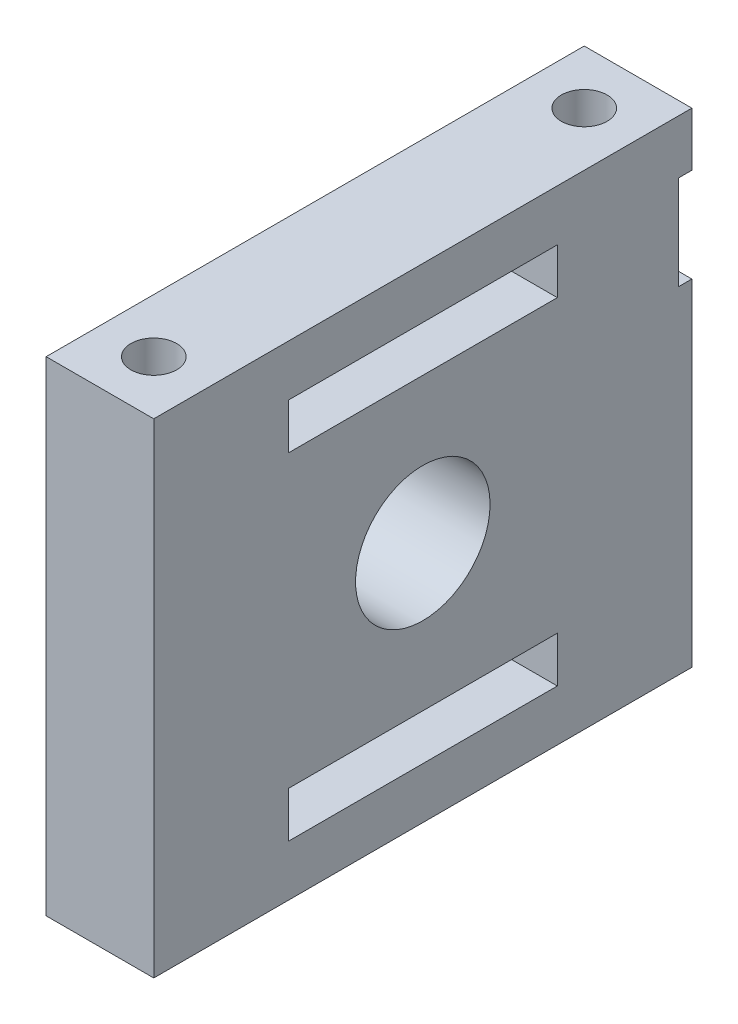
ISO-10303-21;
HEADER;
FILE_DESCRIPTION(('STEP AP214'),'2;1');
FILE_NAME('part.step','',(''),(''),'','','');
FILE_SCHEMA(('AUTOMOTIVE_DESIGN { 1 0 10303 214 1 1 1 1 }'));
ENDSEC;
DATA;
#1=APPLICATION_CONTEXT('core data for automotive mechanical design processes');
#2=APPLICATION_PROTOCOL_DEFINITION('international standard','automotive_design',2000,#1);
#3=PRODUCT_CONTEXT('',#1,'mechanical');
#4=PRODUCT('Part','Part','',(#3));
#5=PRODUCT_RELATED_PRODUCT_CATEGORY('part','',(#4));
#6=PRODUCT_DEFINITION_FORMATION('','',#4);
#7=PRODUCT_DEFINITION_CONTEXT('part definition',#1,'design');
#8=PRODUCT_DEFINITION('design','',#6,#7);
#9=PRODUCT_DEFINITION_SHAPE('','',#8);
#10=(LENGTH_UNIT() NAMED_UNIT(*) SI_UNIT(.MILLI.,.METRE.));
#11=(NAMED_UNIT(*) PLANE_ANGLE_UNIT() SI_UNIT($,.RADIAN.));
#12=(NAMED_UNIT(*) SI_UNIT($,.STERADIAN.) SOLID_ANGLE_UNIT());
#13=UNCERTAINTY_MEASURE_WITH_UNIT(LENGTH_MEASURE(1.E-05),#10,'distance_accuracy_value','');
#14=(GEOMETRIC_REPRESENTATION_CONTEXT(3) GLOBAL_UNCERTAINTY_ASSIGNED_CONTEXT((#13)) GLOBAL_UNIT_ASSIGNED_CONTEXT((#10,
#11,#12)) REPRESENTATION_CONTEXT('',''));
#15=CARTESIAN_POINT('',(0.,0.,0.));
#16=DIRECTION('',(0.,0.,1.));
#17=DIRECTION('',(1.,0.,0.));
#18=AXIS2_PLACEMENT_3D('',#15,#16,#17);
#19=CARTESIAN_POINT('',(8.,0.,-40.));
#20=DIRECTION('',(0.,0.,1.));
#21=DIRECTION('',(0.,-1.,0.));
#22=AXIS2_PLACEMENT_3D('',#19,#20,#21);
#23=PLANE('',#22);
#24=DIRECTION('',(0.,1.,0.));
#25=VECTOR('',#24,1.);
#26=CARTESIAN_POINT('',(0.,0.,-40.));
#27=LINE('',#26,#25);
#28=CARTESIAN_POINT('',(0.,-36.,-40.));
#29=VERTEX_POINT('',#28);
#30=CARTESIAN_POINT('',(0.,-11.,-40.));
#31=VERTEX_POINT('',#30);
#32=EDGE_CURVE('E169',#29,#31,#27,.T.);
#33=ORIENTED_EDGE('',*,*,#32,.T.);
#34=DIRECTION('',(1.,0.,0.));
#35=VECTOR('',#34,1.);
#36=CARTESIAN_POINT('',(0.,-11.,-40.));
#37=LINE('',#36,#35);
#38=CARTESIAN_POINT('',(8.,-11.,-40.));
#39=VERTEX_POINT('',#38);
#40=EDGE_CURVE('E205',#31,#39,#37,.T.);
#41=ORIENTED_EDGE('',*,*,#40,.T.);
#42=DIRECTION('',(0.,1.,0.));
#43=VECTOR('',#42,1.);
#44=CARTESIAN_POINT('',(8.,0.,-40.));
#45=LINE('',#44,#43);
#46=CARTESIAN_POINT('',(8.,-36.,-40.));
#47=VERTEX_POINT('',#46);
#48=EDGE_CURVE('E191',#47,#39,#45,.T.);
#49=ORIENTED_EDGE('',*,*,#48,.F.);
#50=DIRECTION('',(-1.,0.,0.));
#51=VECTOR('',#50,1.);
#52=CARTESIAN_POINT('',(8.,-36.,-40.));
#53=LINE('',#52,#51);
#54=EDGE_CURVE('E41',#47,#29,#53,.T.);
#55=ORIENTED_EDGE('',*,*,#54,.T.);
#56=EDGE_LOOP('',(#33,#41,#49,#55));
#57=FACE_BOUND('',#56,.T.);
#58=ADVANCED_FACE('F33',(#57),#23,.F.);
#59=CARTESIAN_POINT('',(8.,0.,0.));
#60=DIRECTION('',(0.,0.,-1.));
#61=DIRECTION('',(0.,1.,0.));
#62=AXIS2_PLACEMENT_3D('',#59,#60,#61);
#63=PLANE('',#62);
#64=DIRECTION('',(0.,-1.,0.));
#65=VECTOR('',#64,1.);
#66=CARTESIAN_POINT('',(0.,0.,0.));
#67=LINE('',#66,#65);
#68=CARTESIAN_POINT('',(0.,0.,0.));
#69=VERTEX_POINT('',#68);
#70=CARTESIAN_POINT('',(0.,-36.,0.));
#71=VERTEX_POINT('',#70);
#72=EDGE_CURVE('E173',#69,#71,#67,.T.);
#73=ORIENTED_EDGE('',*,*,#72,.T.);
#74=DIRECTION('',(-1.,0.,0.));
#75=VECTOR('',#74,1.);
#76=CARTESIAN_POINT('',(8.,-36.,0.));
#77=LINE('',#76,#75);
#78=CARTESIAN_POINT('',(8.,-36.,0.));
#79=VERTEX_POINT('',#78);
#80=EDGE_CURVE('E11',#79,#71,#77,.T.);
#81=ORIENTED_EDGE('',*,*,#80,.F.);
#82=DIRECTION('',(0.,-1.,0.));
#83=VECTOR('',#82,1.);
#84=CARTESIAN_POINT('',(8.,0.,0.));
#85=LINE('',#84,#83);
#86=CARTESIAN_POINT('',(8.,0.,0.));
#87=VERTEX_POINT('',#86);
#88=EDGE_CURVE('E178',#87,#79,#85,.T.);
#89=ORIENTED_EDGE('',*,*,#88,.F.);
#90=DIRECTION('',(-1.,0.,0.));
#91=VECTOR('',#90,1.);
#92=CARTESIAN_POINT('',(8.,0.,0.));
#93=LINE('',#92,#91);
#94=EDGE_CURVE('E179',#87,#69,#93,.T.);
#95=ORIENTED_EDGE('',*,*,#94,.T.);
#96=EDGE_LOOP('',(#73,#81,#89,#95));
#97=FACE_BOUND('',#96,.T.);
#98=ADVANCED_FACE('F35',(#97),#63,.F.);
#99=CARTESIAN_POINT('',(8.,-36.,0.));
#100=DIRECTION('',(0.,1.,0.));
#101=DIRECTION('',(0.,0.,1.));
#102=AXIS2_PLACEMENT_3D('',#99,#100,#101);
#103=PLANE('',#102);
#104=CARTESIAN_POINT('',(3.99999999999989,-36.,-36.));
#105=DIRECTION('',(0.,1.,0.));
#106=DIRECTION('',(0.,0.,1.));
#107=AXIS2_PLACEMENT_3D('',#104,#105,#106);
#108=CIRCLE('',#107,1.7);
#109=CARTESIAN_POINT('',(3.99999999999989,-36.,-34.3));
#110=VERTEX_POINT('',#109);
#111=EDGE_CURVE('E211',#110,#110,#108,.T.);
#112=ORIENTED_EDGE('',*,*,#111,.T.);
#113=EDGE_LOOP('',(#112));
#114=FACE_BOUND('',#113,.T.);
#115=CARTESIAN_POINT('',(4.,-36.,-4.));
#116=DIRECTION('',(0.,1.,0.));
#117=DIRECTION('',(0.,0.,1.));
#118=AXIS2_PLACEMENT_3D('',#115,#116,#117);
#119=CIRCLE('',#118,1.7);
#120=CARTESIAN_POINT('',(4.,-36.,-2.3));
#121=VERTEX_POINT('',#120);
#122=EDGE_CURVE('E217',#121,#121,#119,.T.);
#123=ORIENTED_EDGE('',*,*,#122,.T.);
#124=EDGE_LOOP('',(#123));
#125=FACE_BOUND('',#124,.T.);
#126=DIRECTION('',(0.,0.,-1.));
#127=VECTOR('',#126,1.);
#128=CARTESIAN_POINT('',(0.,-36.,0.));
#129=LINE('',#128,#127);
#130=EDGE_CURVE('E170',#71,#29,#129,.T.);
#131=ORIENTED_EDGE('',*,*,#130,.T.);
#132=ORIENTED_EDGE('',*,*,#54,.F.);
#133=DIRECTION('',(0.,0.,-1.));
#134=VECTOR('',#133,1.);
#135=CARTESIAN_POINT('',(8.,-36.,0.));
#136=LINE('',#135,#134);
#137=EDGE_CURVE('E292',#79,#47,#136,.T.);
#138=ORIENTED_EDGE('',*,*,#137,.F.);
#139=ORIENTED_EDGE('',*,*,#80,.T.);
#140=EDGE_LOOP('',(#131,#132,#138,#139));
#141=FACE_BOUND('',#140,.T.);
#142=ADVANCED_FACE('F310',(#114,#125,#141),#103,.F.);
#143=CARTESIAN_POINT('',(8.,-4.,-40.));
#144=VERTEX_POINT('',#143);
#145=CARTESIAN_POINT('',(8.,0.,-40.));
#146=VERTEX_POINT('',#145);
#147=EDGE_CURVE('E162',#144,#146,#45,.T.);
#148=ORIENTED_EDGE('',*,*,#147,.F.);
#149=DIRECTION('',(1.,0.,0.));
#150=VECTOR('',#149,1.);
#151=CARTESIAN_POINT('',(0.,-4.,-40.));
#152=LINE('',#151,#150);
#153=CARTESIAN_POINT('',(0.,-4.,-40.));
#154=VERTEX_POINT('',#153);
#155=EDGE_CURVE('E149',#154,#144,#152,.T.);
#156=ORIENTED_EDGE('',*,*,#155,.F.);
#157=CARTESIAN_POINT('',(0.,0.,-40.));
#158=VERTEX_POINT('',#157);
#159=EDGE_CURVE('E160',#154,#158,#27,.T.);
#160=ORIENTED_EDGE('',*,*,#159,.T.);
#161=DIRECTION('',(-1.,0.,0.));
#162=VECTOR('',#161,1.);
#163=CARTESIAN_POINT('',(8.,0.,-40.));
#164=LINE('',#163,#162);
#165=EDGE_CURVE('E182',#146,#158,#164,.T.);
#166=ORIENTED_EDGE('',*,*,#165,.F.);
#167=EDGE_LOOP('',(#148,#156,#160,#166));
#168=FACE_BOUND('',#167,.T.);
#169=ADVANCED_FACE('F158',(#168),#23,.F.);
#170=CARTESIAN_POINT('',(8.,0.,0.));
#171=DIRECTION('',(0.,-1.,0.));
#172=DIRECTION('',(0.,0.,-1.));
#173=AXIS2_PLACEMENT_3D('',#170,#171,#172);
#174=PLANE('',#173);
#175=CARTESIAN_POINT('',(3.99999999999989,0.,-36.));
#176=DIRECTION('',(0.,1.,0.));
#177=DIRECTION('',(0.,0.,1.));
#178=AXIS2_PLACEMENT_3D('',#175,#176,#177);
#179=CIRCLE('',#178,1.7);
#180=CARTESIAN_POINT('',(3.99999999999989,0.,-34.3));
#181=VERTEX_POINT('',#180);
#182=EDGE_CURVE('E207',#181,#181,#179,.T.);
#183=ORIENTED_EDGE('',*,*,#182,.F.);
#184=EDGE_LOOP('',(#183));
#185=FACE_BOUND('',#184,.T.);
#186=CARTESIAN_POINT('',(4.,0.,-4.));
#187=DIRECTION('',(0.,1.,0.));
#188=DIRECTION('',(0.,0.,1.));
#189=AXIS2_PLACEMENT_3D('',#186,#187,#188);
#190=CIRCLE('',#189,1.7);
#191=CARTESIAN_POINT('',(4.,0.,-2.3));
#192=VERTEX_POINT('',#191);
#193=EDGE_CURVE('E214',#192,#192,#190,.T.);
#194=ORIENTED_EDGE('',*,*,#193,.F.);
#195=EDGE_LOOP('',(#194));
#196=FACE_BOUND('',#195,.T.);
#197=DIRECTION('',(0.,0.,1.));
#198=VECTOR('',#197,1.);
#199=CARTESIAN_POINT('',(0.,0.,0.));
#200=LINE('',#199,#198);
#201=EDGE_CURVE('E168',#158,#69,#200,.T.);
#202=ORIENTED_EDGE('',*,*,#201,.T.);
#203=ORIENTED_EDGE('',*,*,#94,.F.);
#204=DIRECTION('',(0.,0.,1.));
#205=VECTOR('',#204,1.);
#206=CARTESIAN_POINT('',(8.,0.,0.));
#207=LINE('',#206,#205);
#208=EDGE_CURVE('E183',#146,#87,#207,.T.);
#209=ORIENTED_EDGE('',*,*,#208,.F.);
#210=ORIENTED_EDGE('',*,*,#165,.T.);
#211=EDGE_LOOP('',(#202,#203,#209,#210));
#212=FACE_BOUND('',#211,.T.);
#213=ADVANCED_FACE('F302',(#185,#196,#212),#174,.F.);
#214=CARTESIAN_POINT('',(8.,0.,0.));
#215=DIRECTION('',(1.,0.,0.));
#216=DIRECTION('',(0.,0.,-1.));
#217=AXIS2_PLACEMENT_3D('',#214,#215,#216);
#218=PLANE('',#217);
#219=DIRECTION('',(0.,0.,-1.));
#220=VECTOR('',#219,1.);
#221=CARTESIAN_POINT('',(8.,-11.,-40.));
#222=LINE('',#221,#220);
#223=CARTESIAN_POINT('',(8.,-11.,-39.));
#224=VERTEX_POINT('',#223);
#225=EDGE_CURVE('E154',#224,#39,#222,.T.);
#226=ORIENTED_EDGE('',*,*,#225,.F.);
#227=DIRECTION('',(0.,-1.,0.));
#228=VECTOR('',#227,1.);
#229=CARTESIAN_POINT('',(8.,-11.,-39.));
#230=LINE('',#229,#228);
#231=CARTESIAN_POINT('',(8.,-4.,-39.));
#232=VERTEX_POINT('',#231);
#233=EDGE_CURVE('E201',#232,#224,#230,.T.);
#234=ORIENTED_EDGE('',*,*,#233,.F.);
#235=DIRECTION('',(0.,0.,1.));
#236=VECTOR('',#235,1.);
#237=CARTESIAN_POINT('',(8.,-4.,-40.));
#238=LINE('',#237,#236);
#239=EDGE_CURVE('E199',#144,#232,#238,.T.);
#240=ORIENTED_EDGE('',*,*,#239,.F.);
#241=ORIENTED_EDGE('',*,*,#147,.T.);
#242=ORIENTED_EDGE('',*,*,#208,.T.);
#243=ORIENTED_EDGE('',*,*,#88,.T.);
#244=ORIENTED_EDGE('',*,*,#137,.T.);
#245=ORIENTED_EDGE('',*,*,#48,.T.);
#246=EDGE_LOOP('',(#226,#234,#240,#241,#242,#243,#244,#245));
#247=FACE_BOUND('',#246,.T.);
#248=DIRECTION('',(0.,-1.,0.));
#249=VECTOR('',#248,1.);
#250=CARTESIAN_POINT('',(8.,-28.8,-10.0000000000003));
#251=LINE('',#250,#249);
#252=CARTESIAN_POINT('',(8.,-28.8,-10.0000000000003));
#253=VERTEX_POINT('',#252);
#254=CARTESIAN_POINT('',(8.,-32.2,-10.0000000000003));
#255=VERTEX_POINT('',#254);
#256=EDGE_CURVE('E56',#253,#255,#251,.T.);
#257=ORIENTED_EDGE('',*,*,#256,.F.);
#258=DIRECTION('',(0.,0.,1.));
#259=VECTOR('',#258,1.);
#260=CARTESIAN_POINT('',(8.,-28.8,-10.0000000000003));
#261=LINE('',#260,#259);
#262=CARTESIAN_POINT('',(8.,-28.8,-30.0000000000003));
#263=VERTEX_POINT('',#262);
#264=EDGE_CURVE('E226',#263,#253,#261,.T.);
#265=ORIENTED_EDGE('',*,*,#264,.F.);
#266=DIRECTION('',(0.,1.,0.));
#267=VECTOR('',#266,1.);
#268=CARTESIAN_POINT('',(8.,-28.8,-30.0000000000003));
#269=LINE('',#268,#267);
#270=CARTESIAN_POINT('',(8.,-32.2,-30.0000000000003));
#271=VERTEX_POINT('',#270);
#272=EDGE_CURVE('E240',#271,#263,#269,.T.);
#273=ORIENTED_EDGE('',*,*,#272,.F.);
#274=DIRECTION('',(0.,0.,-1.));
#275=VECTOR('',#274,1.);
#276=CARTESIAN_POINT('',(8.,-32.2,-10.0000000000003));
#277=LINE('',#276,#275);
#278=EDGE_CURVE('E237',#255,#271,#277,.T.);
#279=ORIENTED_EDGE('',*,*,#278,.F.);
#280=EDGE_LOOP('',(#257,#265,#273,#279));
#281=FACE_BOUND('',#280,.T.);
#282=DIRECTION('',(0.,-1.,0.));
#283=VECTOR('',#282,1.);
#284=CARTESIAN_POINT('',(8.,-3.8,-10.));
#285=LINE('',#284,#283);
#286=CARTESIAN_POINT('',(8.,-3.8,-10.));
#287=VERTEX_POINT('',#286);
#288=CARTESIAN_POINT('',(8.,-7.2,-10.));
#289=VERTEX_POINT('',#288);
#290=EDGE_CURVE('E247',#287,#289,#285,.T.);
#291=ORIENTED_EDGE('',*,*,#290,.F.);
#292=DIRECTION('',(0.,0.,1.));
#293=VECTOR('',#292,1.);
#294=CARTESIAN_POINT('',(8.,-3.8,-10.));
#295=LINE('',#294,#293);
#296=CARTESIAN_POINT('',(8.,-3.8,-30.));
#297=VERTEX_POINT('',#296);
#298=EDGE_CURVE('E257',#297,#287,#295,.T.);
#299=ORIENTED_EDGE('',*,*,#298,.F.);
#300=DIRECTION('',(0.,1.,0.));
#301=VECTOR('',#300,1.);
#302=CARTESIAN_POINT('',(8.,-3.8,-30.));
#303=LINE('',#302,#301);
#304=CARTESIAN_POINT('',(8.,-7.2,-30.));
#305=VERTEX_POINT('',#304);
#306=EDGE_CURVE('E271',#305,#297,#303,.T.);
#307=ORIENTED_EDGE('',*,*,#306,.F.);
#308=DIRECTION('',(0.,0.,-1.));
#309=VECTOR('',#308,1.);
#310=CARTESIAN_POINT('',(8.,-7.2,-10.));
#311=LINE('',#310,#309);
#312=EDGE_CURVE('E268',#289,#305,#311,.T.);
#313=ORIENTED_EDGE('',*,*,#312,.F.);
#314=EDGE_LOOP('',(#291,#299,#307,#313));
#315=FACE_BOUND('',#314,.T.);
#316=CARTESIAN_POINT('',(8.,-18.,-20.));
#317=DIRECTION('',(1.,0.,0.));
#318=DIRECTION('',(0.,0.,-1.));
#319=AXIS2_PLACEMENT_3D('',#316,#317,#318);
#320=CIRCLE('',#319,5.);
#321=CARTESIAN_POINT('',(8.,-18.,-25.));
#322=VERTEX_POINT('',#321);
#323=EDGE_CURVE('E278',#322,#322,#320,.T.);
#324=ORIENTED_EDGE('',*,*,#323,.F.);
#325=EDGE_LOOP('',(#324));
#326=FACE_BOUND('',#325,.T.);
#327=ADVANCED_FACE('F305',(#247,#281,#315,#326),#218,.T.);
#328=CARTESIAN_POINT('',(0.,0.,0.));
#329=DIRECTION('',(1.,0.,0.));
#330=DIRECTION('',(0.,0.,-1.));
#331=AXIS2_PLACEMENT_3D('',#328,#329,#330);
#332=PLANE('',#331);
#333=DIRECTION('',(0.,0.,1.));
#334=VECTOR('',#333,1.);
#335=CARTESIAN_POINT('',(0.,-28.8,-10.0000000000003));
#336=LINE('',#335,#334);
#337=CARTESIAN_POINT('',(0.,-28.8,-30.0000000000003));
#338=VERTEX_POINT('',#337);
#339=CARTESIAN_POINT('',(0.,-28.8,-10.0000000000003));
#340=VERTEX_POINT('',#339);
#341=EDGE_CURVE('E232',#338,#340,#336,.T.);
#342=ORIENTED_EDGE('',*,*,#341,.T.);
#343=DIRECTION('',(0.,-1.,0.));
#344=VECTOR('',#343,1.);
#345=CARTESIAN_POINT('',(0.,-28.8,-10.0000000000003));
#346=LINE('',#345,#344);
#347=CARTESIAN_POINT('',(0.,-32.2,-10.0000000000003));
#348=VERTEX_POINT('',#347);
#349=EDGE_CURVE('E222',#340,#348,#346,.T.);
#350=ORIENTED_EDGE('',*,*,#349,.T.);
#351=DIRECTION('',(0.,0.,-1.));
#352=VECTOR('',#351,1.);
#353=CARTESIAN_POINT('',(0.,-32.2,-10.0000000000003));
#354=LINE('',#353,#352);
#355=CARTESIAN_POINT('',(0.,-32.2,-30.0000000000003));
#356=VERTEX_POINT('',#355);
#357=EDGE_CURVE('E225',#348,#356,#354,.T.);
#358=ORIENTED_EDGE('',*,*,#357,.T.);
#359=DIRECTION('',(0.,1.,0.));
#360=VECTOR('',#359,1.);
#361=CARTESIAN_POINT('',(0.,-28.8,-30.0000000000003));
#362=LINE('',#361,#360);
#363=EDGE_CURVE('E229',#356,#338,#362,.T.);
#364=ORIENTED_EDGE('',*,*,#363,.T.);
#365=EDGE_LOOP('',(#342,#350,#358,#364));
#366=FACE_BOUND('',#365,.T.);
#367=DIRECTION('',(0.,0.,1.));
#368=VECTOR('',#367,1.);
#369=CARTESIAN_POINT('',(0.,-3.8,-10.));
#370=LINE('',#369,#368);
#371=CARTESIAN_POINT('',(0.,-3.8,-30.));
#372=VERTEX_POINT('',#371);
#373=CARTESIAN_POINT('',(0.,-3.8,-10.));
#374=VERTEX_POINT('',#373);
#375=EDGE_CURVE('E263',#372,#374,#370,.T.);
#376=ORIENTED_EDGE('',*,*,#375,.T.);
#377=DIRECTION('',(0.,-1.,0.));
#378=VECTOR('',#377,1.);
#379=CARTESIAN_POINT('',(0.,-3.8,-10.));
#380=LINE('',#379,#378);
#381=CARTESIAN_POINT('',(0.,-7.2,-10.));
#382=VERTEX_POINT('',#381);
#383=EDGE_CURVE('E253',#374,#382,#380,.T.);
#384=ORIENTED_EDGE('',*,*,#383,.T.);
#385=DIRECTION('',(0.,0.,-1.));
#386=VECTOR('',#385,1.);
#387=CARTESIAN_POINT('',(0.,-7.2,-10.));
#388=LINE('',#387,#386);
#389=CARTESIAN_POINT('',(0.,-7.2,-30.));
#390=VERTEX_POINT('',#389);
#391=EDGE_CURVE('E256',#382,#390,#388,.T.);
#392=ORIENTED_EDGE('',*,*,#391,.T.);
#393=DIRECTION('',(0.,1.,0.));
#394=VECTOR('',#393,1.);
#395=CARTESIAN_POINT('',(0.,-3.8,-30.));
#396=LINE('',#395,#394);
#397=EDGE_CURVE('E260',#390,#372,#396,.T.);
#398=ORIENTED_EDGE('',*,*,#397,.T.);
#399=EDGE_LOOP('',(#376,#384,#392,#398));
#400=FACE_BOUND('',#399,.T.);
#401=CARTESIAN_POINT('',(0.,-18.,-20.));
#402=DIRECTION('',(1.,0.,0.));
#403=DIRECTION('',(0.,0.,-1.));
#404=AXIS2_PLACEMENT_3D('',#401,#402,#403);
#405=CIRCLE('',#404,5.);
#406=CARTESIAN_POINT('',(0.,-18.,-25.));
#407=VERTEX_POINT('',#406);
#408=EDGE_CURVE('E285',#407,#407,#405,.T.);
#409=ORIENTED_EDGE('',*,*,#408,.T.);
#410=EDGE_LOOP('',(#409));
#411=FACE_BOUND('',#410,.T.);
#412=DIRECTION('',(0.,-1.,0.));
#413=VECTOR('',#412,1.);
#414=CARTESIAN_POINT('',(0.,-11.,-39.));
#415=LINE('',#414,#413);
#416=CARTESIAN_POINT('',(0.,-4.,-39.));
#417=VERTEX_POINT('',#416);
#418=CARTESIAN_POINT('',(0.,-11.,-39.));
#419=VERTEX_POINT('',#418);
#420=EDGE_CURVE('E48',#417,#419,#415,.T.);
#421=ORIENTED_EDGE('',*,*,#420,.T.);
#422=DIRECTION('',(0.,0.,-1.));
#423=VECTOR('',#422,1.);
#424=CARTESIAN_POINT('',(0.,-11.,-40.));
#425=LINE('',#424,#423);
#426=EDGE_CURVE('E163',#419,#31,#425,.T.);
#427=ORIENTED_EDGE('',*,*,#426,.T.);
#428=ORIENTED_EDGE('',*,*,#32,.F.);
#429=ORIENTED_EDGE('',*,*,#130,.F.);
#430=ORIENTED_EDGE('',*,*,#72,.F.);
#431=ORIENTED_EDGE('',*,*,#201,.F.);
#432=ORIENTED_EDGE('',*,*,#159,.F.);
#433=DIRECTION('',(0.,0.,1.));
#434=VECTOR('',#433,1.);
#435=CARTESIAN_POINT('',(0.,-4.,-40.));
#436=LINE('',#435,#434);
#437=EDGE_CURVE('E145',#154,#417,#436,.T.);
#438=ORIENTED_EDGE('',*,*,#437,.T.);
#439=EDGE_LOOP('',(#421,#427,#428,#429,#430,#431,#432,#438));
#440=FACE_BOUND('',#439,.T.);
#441=ADVANCED_FACE('F166',(#366,#400,#411,#440),#332,.F.);
#442=CARTESIAN_POINT('',(0.,-18.,-20.));
#443=DIRECTION('',(1.,0.,0.));
#444=DIRECTION('',(0.,0.,-1.));
#445=AXIS2_PLACEMENT_3D('',#442,#443,#444);
#446=CYLINDRICAL_SURFACE('',#445,5.);
#447=ORIENTED_EDGE('',*,*,#408,.F.);
#448=EDGE_LOOP('',(#447));
#449=FACE_BOUND('',#448,.T.);
#450=ORIENTED_EDGE('',*,*,#323,.T.);
#451=EDGE_LOOP('',(#450));
#452=FACE_BOUND('',#451,.T.);
#453=ADVANCED_FACE('F330',(#449,#452),#446,.F.);
#454=CARTESIAN_POINT('',(0.,-3.8,-10.));
#455=DIRECTION('',(0.,0.,1.));
#456=DIRECTION('',(1.,0.,0.));
#457=AXIS2_PLACEMENT_3D('',#454,#455,#456);
#458=PLANE('',#457);
#459=ORIENTED_EDGE('',*,*,#290,.T.);
#460=DIRECTION('',(1.,0.,0.));
#461=VECTOR('',#460,1.);
#462=CARTESIAN_POINT('',(0.,-7.2,-10.));
#463=LINE('',#462,#461);
#464=EDGE_CURVE('E266',#382,#289,#463,.T.);
#465=ORIENTED_EDGE('',*,*,#464,.F.);
#466=ORIENTED_EDGE('',*,*,#383,.F.);
#467=DIRECTION('',(1.,0.,0.));
#468=VECTOR('',#467,1.);
#469=CARTESIAN_POINT('',(0.,-3.8,-10.));
#470=LINE('',#469,#468);
#471=EDGE_CURVE('E276',#374,#287,#470,.T.);
#472=ORIENTED_EDGE('',*,*,#471,.T.);
#473=EDGE_LOOP('',(#459,#465,#466,#472));
#474=FACE_BOUND('',#473,.T.);
#475=ADVANCED_FACE('F336',(#474),#458,.F.);
#476=CARTESIAN_POINT('',(0.,-3.8,-10.));
#477=DIRECTION('',(0.,1.,0.));
#478=DIRECTION('',(0.,0.,1.));
#479=AXIS2_PLACEMENT_3D('',#476,#477,#478);
#480=PLANE('',#479);
#481=ORIENTED_EDGE('',*,*,#298,.T.);
#482=ORIENTED_EDGE('',*,*,#471,.F.);
#483=ORIENTED_EDGE('',*,*,#375,.F.);
#484=DIRECTION('',(1.,0.,0.));
#485=VECTOR('',#484,1.);
#486=CARTESIAN_POINT('',(0.,-3.8,-30.));
#487=LINE('',#486,#485);
#488=EDGE_CURVE('E279',#372,#297,#487,.T.);
#489=ORIENTED_EDGE('',*,*,#488,.T.);
#490=EDGE_LOOP('',(#481,#482,#483,#489));
#491=FACE_BOUND('',#490,.T.);
#492=ADVANCED_FACE('F340',(#491),#480,.F.);
#493=CARTESIAN_POINT('',(0.,-3.8,-30.));
#494=DIRECTION('',(0.,0.,-1.));
#495=DIRECTION('',(-1.,0.,0.));
#496=AXIS2_PLACEMENT_3D('',#493,#494,#495);
#497=PLANE('',#496);
#498=ORIENTED_EDGE('',*,*,#306,.T.);
#499=ORIENTED_EDGE('',*,*,#488,.F.);
#500=ORIENTED_EDGE('',*,*,#397,.F.);
#501=DIRECTION('',(1.,0.,0.));
#502=VECTOR('',#501,1.);
#503=CARTESIAN_POINT('',(0.,-7.2,-30.));
#504=LINE('',#503,#502);
#505=EDGE_CURVE('E281',#390,#305,#504,.T.);
#506=ORIENTED_EDGE('',*,*,#505,.T.);
#507=EDGE_LOOP('',(#498,#499,#500,#506));
#508=FACE_BOUND('',#507,.T.);
#509=ADVANCED_FACE('F346',(#508),#497,.F.);
#510=CARTESIAN_POINT('',(0.,-7.2,-10.));
#511=DIRECTION('',(0.,-1.,0.));
#512=DIRECTION('',(0.,0.,-1.));
#513=AXIS2_PLACEMENT_3D('',#510,#511,#512);
#514=PLANE('',#513);
#515=ORIENTED_EDGE('',*,*,#312,.T.);
#516=ORIENTED_EDGE('',*,*,#505,.F.);
#517=ORIENTED_EDGE('',*,*,#391,.F.);
#518=ORIENTED_EDGE('',*,*,#464,.T.);
#519=EDGE_LOOP('',(#515,#516,#517,#518));
#520=FACE_BOUND('',#519,.T.);
#521=ADVANCED_FACE('F342',(#520),#514,.F.);
#522=CARTESIAN_POINT('',(0.,-28.8,-10.0000000000003));
#523=DIRECTION('',(0.,0.,1.));
#524=DIRECTION('',(1.,0.,0.));
#525=AXIS2_PLACEMENT_3D('',#522,#523,#524);
#526=PLANE('',#525);
#527=ORIENTED_EDGE('',*,*,#256,.T.);
#528=DIRECTION('',(1.,0.,0.));
#529=VECTOR('',#528,1.);
#530=CARTESIAN_POINT('',(0.,-32.2,-10.0000000000003));
#531=LINE('',#530,#529);
#532=EDGE_CURVE('E235',#348,#255,#531,.T.);
#533=ORIENTED_EDGE('',*,*,#532,.F.);
#534=ORIENTED_EDGE('',*,*,#349,.F.);
#535=DIRECTION('',(1.,0.,0.));
#536=VECTOR('',#535,1.);
#537=CARTESIAN_POINT('',(0.,-28.8,-10.0000000000003));
#538=LINE('',#537,#536);
#539=EDGE_CURVE('E245',#340,#253,#538,.T.);
#540=ORIENTED_EDGE('',*,*,#539,.T.);
#541=EDGE_LOOP('',(#527,#533,#534,#540));
#542=FACE_BOUND('',#541,.T.);
#543=ADVANCED_FACE('F345',(#542),#526,.F.);
#544=CARTESIAN_POINT('',(0.,-28.8,-10.0000000000003));
#545=DIRECTION('',(0.,1.,0.));
#546=DIRECTION('',(0.,0.,1.));
#547=AXIS2_PLACEMENT_3D('',#544,#545,#546);
#548=PLANE('',#547);
#549=ORIENTED_EDGE('',*,*,#264,.T.);
#550=ORIENTED_EDGE('',*,*,#539,.F.);
#551=ORIENTED_EDGE('',*,*,#341,.F.);
#552=DIRECTION('',(1.,0.,0.));
#553=VECTOR('',#552,1.);
#554=CARTESIAN_POINT('',(0.,-28.8,-30.0000000000003));
#555=LINE('',#554,#553);
#556=EDGE_CURVE('E248',#338,#263,#555,.T.);
#557=ORIENTED_EDGE('',*,*,#556,.T.);
#558=EDGE_LOOP('',(#549,#550,#551,#557));
#559=FACE_BOUND('',#558,.T.);
#560=ADVANCED_FACE('F356',(#559),#548,.F.);
#561=CARTESIAN_POINT('',(0.,-28.8,-30.0000000000003));
#562=DIRECTION('',(0.,0.,-1.));
#563=DIRECTION('',(-1.,0.,0.));
#564=AXIS2_PLACEMENT_3D('',#561,#562,#563);
#565=PLANE('',#564);
#566=ORIENTED_EDGE('',*,*,#272,.T.);
#567=ORIENTED_EDGE('',*,*,#556,.F.);
#568=ORIENTED_EDGE('',*,*,#363,.F.);
#569=DIRECTION('',(1.,0.,0.));
#570=VECTOR('',#569,1.);
#571=CARTESIAN_POINT('',(0.,-32.2,-30.0000000000003));
#572=LINE('',#571,#570);
#573=EDGE_CURVE('E250',#356,#271,#572,.T.);
#574=ORIENTED_EDGE('',*,*,#573,.T.);
#575=EDGE_LOOP('',(#566,#567,#568,#574));
#576=FACE_BOUND('',#575,.T.);
#577=ADVANCED_FACE('F361',(#576),#565,.F.);
#578=CARTESIAN_POINT('',(0.,-32.2,-10.0000000000003));
#579=DIRECTION('',(0.,-1.,0.));
#580=DIRECTION('',(0.,0.,-1.));
#581=AXIS2_PLACEMENT_3D('',#578,#579,#580);
#582=PLANE('',#581);
#583=ORIENTED_EDGE('',*,*,#278,.T.);
#584=ORIENTED_EDGE('',*,*,#573,.F.);
#585=ORIENTED_EDGE('',*,*,#357,.F.);
#586=ORIENTED_EDGE('',*,*,#532,.T.);
#587=EDGE_LOOP('',(#583,#584,#585,#586));
#588=FACE_BOUND('',#587,.T.);
#589=ADVANCED_FACE('F357',(#588),#582,.F.);
#590=CARTESIAN_POINT('',(4.,-36.,-4.));
#591=DIRECTION('',(0.,1.,0.));
#592=DIRECTION('',(0.,0.,1.));
#593=AXIS2_PLACEMENT_3D('',#590,#591,#592);
#594=CYLINDRICAL_SURFACE('',#593,1.7);
#595=ORIENTED_EDGE('',*,*,#122,.F.);
#596=EDGE_LOOP('',(#595));
#597=FACE_BOUND('',#596,.T.);
#598=ORIENTED_EDGE('',*,*,#193,.T.);
#599=EDGE_LOOP('',(#598));
#600=FACE_BOUND('',#599,.T.);
#601=ADVANCED_FACE('F360',(#597,#600),#594,.F.);
#602=CARTESIAN_POINT('',(3.99999999999989,-36.,-36.));
#603=DIRECTION('',(0.,1.,0.));
#604=DIRECTION('',(0.,0.,1.));
#605=AXIS2_PLACEMENT_3D('',#602,#603,#604);
#606=CYLINDRICAL_SURFACE('',#605,1.7);
#607=ORIENTED_EDGE('',*,*,#111,.F.);
#608=EDGE_LOOP('',(#607));
#609=FACE_BOUND('',#608,.T.);
#610=ORIENTED_EDGE('',*,*,#182,.T.);
#611=EDGE_LOOP('',(#610));
#612=FACE_BOUND('',#611,.T.);
#613=ADVANCED_FACE('F371',(#609,#612),#606,.F.);
#614=CARTESIAN_POINT('',(0.,-11.,-40.));
#615=DIRECTION('',(0.,-1.,0.));
#616=DIRECTION('',(0.,0.,-1.));
#617=AXIS2_PLACEMENT_3D('',#614,#615,#616);
#618=PLANE('',#617);
#619=ORIENTED_EDGE('',*,*,#225,.T.);
#620=ORIENTED_EDGE('',*,*,#40,.F.);
#621=ORIENTED_EDGE('',*,*,#426,.F.);
#622=DIRECTION('',(1.,0.,0.));
#623=VECTOR('',#622,1.);
#624=CARTESIAN_POINT('',(0.,-11.,-39.));
#625=LINE('',#624,#623);
#626=EDGE_CURVE('E208',#419,#224,#625,.T.);
#627=ORIENTED_EDGE('',*,*,#626,.T.);
#628=EDGE_LOOP('',(#619,#620,#621,#627));
#629=FACE_BOUND('',#628,.T.);
#630=ADVANCED_FACE('F309',(#629),#618,.F.);
#631=CARTESIAN_POINT('',(0.,-11.,-39.));
#632=DIRECTION('',(0.,0.,1.));
#633=DIRECTION('',(1.,0.,0.));
#634=AXIS2_PLACEMENT_3D('',#631,#632,#633);
#635=PLANE('',#634);
#636=ORIENTED_EDGE('',*,*,#233,.T.);
#637=ORIENTED_EDGE('',*,*,#626,.F.);
#638=ORIENTED_EDGE('',*,*,#420,.F.);
#639=DIRECTION('',(1.,0.,0.));
#640=VECTOR('',#639,1.);
#641=CARTESIAN_POINT('',(0.,-4.,-39.));
#642=LINE('',#641,#640);
#643=EDGE_CURVE('E151',#417,#232,#642,.T.);
#644=ORIENTED_EDGE('',*,*,#643,.T.);
#645=EDGE_LOOP('',(#636,#637,#638,#644));
#646=FACE_BOUND('',#645,.T.);
#647=ADVANCED_FACE('F308',(#646),#635,.F.);
#648=CARTESIAN_POINT('',(0.,-4.,-40.));
#649=DIRECTION('',(0.,1.,0.));
#650=DIRECTION('',(0.,0.,1.));
#651=AXIS2_PLACEMENT_3D('',#648,#649,#650);
#652=PLANE('',#651);
#653=ORIENTED_EDGE('',*,*,#239,.T.);
#654=ORIENTED_EDGE('',*,*,#643,.F.);
#655=ORIENTED_EDGE('',*,*,#437,.F.);
#656=ORIENTED_EDGE('',*,*,#155,.T.);
#657=EDGE_LOOP('',(#653,#654,#655,#656));
#658=FACE_BOUND('',#657,.T.);
#659=ADVANCED_FACE('F148',(#658),#652,.F.);
#660=CLOSED_SHELL('',(#58,#98,#142,#169,#213,#327,#441,#453,#475,#492,#509,#521,#543,#560,#577,
#589,#601,#613,#630,#647,#659));
#661=MANIFOLD_SOLID_BREP('B2',#660);
#662=ADVANCED_BREP_SHAPE_REPRESENTATION('',(#18,#661),#14);
#663=SHAPE_DEFINITION_REPRESENTATION(#9,#662);
ENDSEC;
END-ISO-10303-21;
